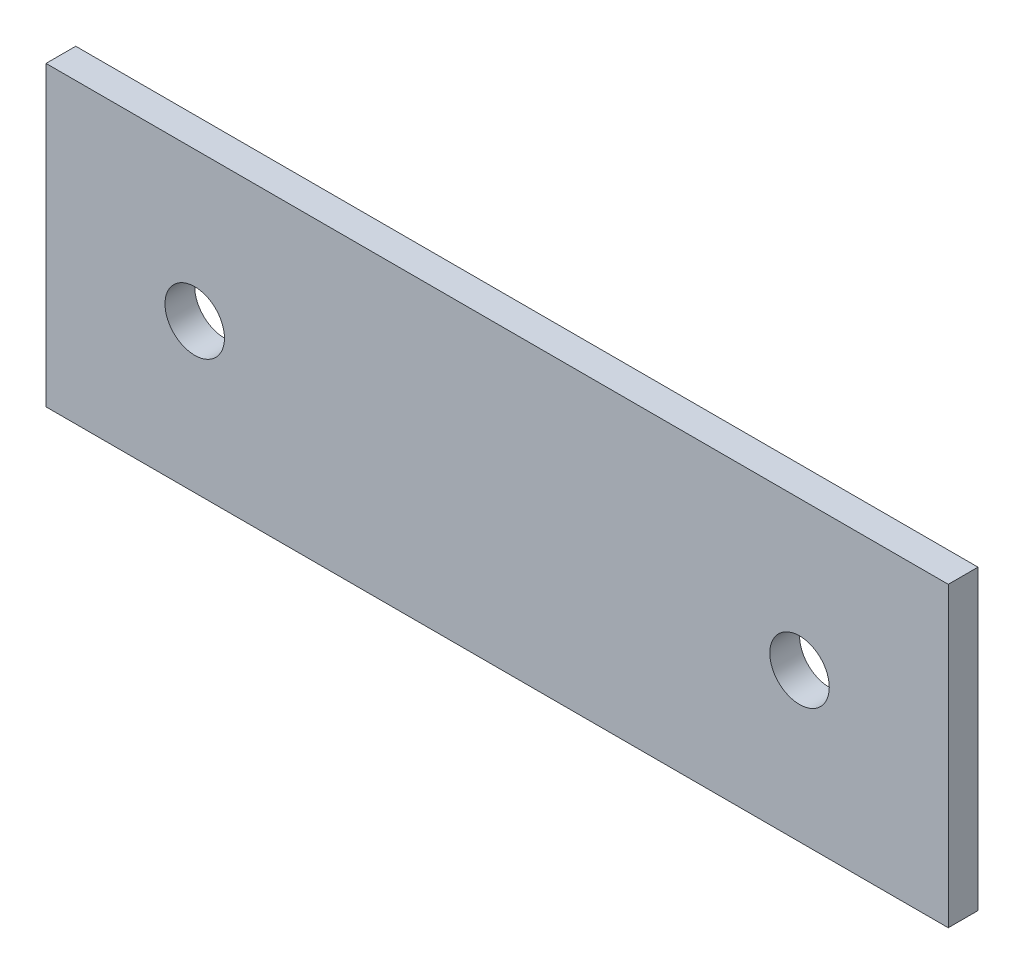
ISO-10303-21;
HEADER;
FILE_DESCRIPTION(('STEP AP214'),'2;1');
FILE_NAME('part.step','',(''),(''),'','','');
FILE_SCHEMA(('AUTOMOTIVE_DESIGN { 1 0 10303 214 1 1 1 1 }'));
ENDSEC;
DATA;
#1=APPLICATION_CONTEXT('core data for automotive mechanical design processes');
#2=APPLICATION_PROTOCOL_DEFINITION('international standard','automotive_design',2000,#1);
#3=PRODUCT_CONTEXT('',#1,'mechanical');
#4=PRODUCT('Part','Part','',(#3));
#5=PRODUCT_RELATED_PRODUCT_CATEGORY('part','',(#4));
#6=PRODUCT_DEFINITION_FORMATION('','',#4);
#7=PRODUCT_DEFINITION_CONTEXT('part definition',#1,'design');
#8=PRODUCT_DEFINITION('design','',#6,#7);
#9=PRODUCT_DEFINITION_SHAPE('','',#8);
#10=(LENGTH_UNIT() NAMED_UNIT(*) SI_UNIT(.MILLI.,.METRE.));
#11=(NAMED_UNIT(*) PLANE_ANGLE_UNIT() SI_UNIT($,.RADIAN.));
#12=(NAMED_UNIT(*) SI_UNIT($,.STERADIAN.) SOLID_ANGLE_UNIT());
#13=UNCERTAINTY_MEASURE_WITH_UNIT(LENGTH_MEASURE(1.E-05),#10,'distance_accuracy_value','');
#14=(GEOMETRIC_REPRESENTATION_CONTEXT(3) GLOBAL_UNCERTAINTY_ASSIGNED_CONTEXT((#13)) GLOBAL_UNIT_ASSIGNED_CONTEXT((#10,
#11,#12)) REPRESENTATION_CONTEXT('',''));
#15=CARTESIAN_POINT('',(0.,0.,0.));
#16=DIRECTION('',(0.,0.,1.));
#17=DIRECTION('',(1.,0.,0.));
#18=AXIS2_PLACEMENT_3D('',#15,#16,#17);
#19=CARTESIAN_POINT('',(-36.0672653272042,-0.000631578947363209,1.5));
#20=DIRECTION('',(0.,0.,1.));
#21=DIRECTION('',(1.,0.,0.));
#22=AXIS2_PLACEMENT_3D('',#19,#20,#21);
#23=PLANE('',#22);
#24=CARTESIAN_POINT('',(-28.5672653272042,7.49936842105264,1.5));
#25=DIRECTION('',(0.,0.,1.));
#26=DIRECTION('',(1.,0.,0.));
#27=AXIS2_PLACEMENT_3D('',#24,#25,#26);
#28=CIRCLE('',#27,1.5);
#29=CARTESIAN_POINT('',(-27.0672653272042,7.49936842105264,1.5));
#30=VERTEX_POINT('',#29);
#31=EDGE_CURVE('E98',#30,#30,#28,.T.);
#32=ORIENTED_EDGE('',*,*,#31,.F.);
#33=EDGE_LOOP('',(#32));
#34=FACE_BOUND('',#33,.T.);
#35=DIRECTION('',(0.,-1.,0.));
#36=VECTOR('',#35,1.);
#37=CARTESIAN_POINT('',(-36.0672653272042,14.9993684210526,1.5));
#38=LINE('',#37,#36);
#39=CARTESIAN_POINT('',(-36.0672653272042,14.9993684210526,1.5));
#40=VERTEX_POINT('',#39);
#41=CARTESIAN_POINT('',(-36.0672653272042,-0.000631578947363209,1.5));
#42=VERTEX_POINT('',#41);
#43=EDGE_CURVE('E83',#40,#42,#38,.T.);
#44=ORIENTED_EDGE('',*,*,#43,.T.);
#45=DIRECTION('',(1.,0.,0.));
#46=VECTOR('',#45,1.);
#47=CARTESIAN_POINT('',(-36.0672653272042,-0.000631578947363209,1.5));
#48=LINE('',#47,#46);
#49=CARTESIAN_POINT('',(9.43273467279583,-0.000631578947363209,1.5));
#50=VERTEX_POINT('',#49);
#51=EDGE_CURVE('E78',#42,#50,#48,.T.);
#52=ORIENTED_EDGE('',*,*,#51,.T.);
#53=DIRECTION('',(0.,1.,0.));
#54=VECTOR('',#53,1.);
#55=CARTESIAN_POINT('',(9.43273467279583,14.9993684210526,1.5));
#56=LINE('',#55,#54);
#57=CARTESIAN_POINT('',(9.43273467279583,14.9993684210526,1.5));
#58=VERTEX_POINT('',#57);
#59=EDGE_CURVE('E81',#50,#58,#56,.T.);
#60=ORIENTED_EDGE('',*,*,#59,.T.);
#61=DIRECTION('',(-1.,0.,0.));
#62=VECTOR('',#61,1.);
#63=CARTESIAN_POINT('',(-36.0672653272042,14.9993684210526,1.5));
#64=LINE('',#63,#62);
#65=EDGE_CURVE('E48',#58,#40,#64,.T.);
#66=ORIENTED_EDGE('',*,*,#65,.T.);
#67=EDGE_LOOP('',(#44,#52,#60,#66));
#68=FACE_BOUND('',#67,.T.);
#69=CARTESIAN_POINT('',(1.93273467279583,7.49936842105264,1.5));
#70=DIRECTION('',(0.,0.,1.));
#71=DIRECTION('',(1.,0.,0.));
#72=AXIS2_PLACEMENT_3D('',#69,#70,#71);
#73=CIRCLE('',#72,1.5);
#74=CARTESIAN_POINT('',(3.43273467279583,7.49936842105264,1.5));
#75=VERTEX_POINT('',#74);
#76=EDGE_CURVE('E113',#75,#75,#73,.T.);
#77=ORIENTED_EDGE('',*,*,#76,.F.);
#78=EDGE_LOOP('',(#77));
#79=FACE_BOUND('',#78,.T.);
#80=ADVANCED_FACE('F31',(#34,#68,#79),#23,.T.);
#81=CARTESIAN_POINT('',(-36.0672653272042,-0.000631578947363209,0.));
#82=DIRECTION('',(0.,0.,1.));
#83=DIRECTION('',(1.,0.,0.));
#84=AXIS2_PLACEMENT_3D('',#81,#82,#83);
#85=PLANE('',#84);
#86=CARTESIAN_POINT('',(-28.5672653272042,7.49936842105264,0.));
#87=DIRECTION('',(0.,0.,1.));
#88=DIRECTION('',(1.,0.,0.));
#89=AXIS2_PLACEMENT_3D('',#86,#87,#88);
#90=CIRCLE('',#89,1.5);
#91=CARTESIAN_POINT('',(-27.0672653272042,7.49936842105264,0.));
#92=VERTEX_POINT('',#91);
#93=EDGE_CURVE('E110',#92,#92,#90,.T.);
#94=ORIENTED_EDGE('',*,*,#93,.T.);
#95=EDGE_LOOP('',(#94));
#96=FACE_BOUND('',#95,.T.);
#97=DIRECTION('',(0.,-1.,0.));
#98=VECTOR('',#97,1.);
#99=CARTESIAN_POINT('',(-36.0672653272042,14.9993684210526,0.));
#100=LINE('',#99,#98);
#101=CARTESIAN_POINT('',(-36.0672653272042,14.9993684210526,0.));
#102=VERTEX_POINT('',#101);
#103=CARTESIAN_POINT('',(-36.0672653272042,-0.000631578947363209,0.));
#104=VERTEX_POINT('',#103);
#105=EDGE_CURVE('E95',#102,#104,#100,.T.);
#106=ORIENTED_EDGE('',*,*,#105,.F.);
#107=DIRECTION('',(-1.,0.,0.));
#108=VECTOR('',#107,1.);
#109=CARTESIAN_POINT('',(-36.0672653272042,14.9993684210526,0.));
#110=LINE('',#109,#108);
#111=CARTESIAN_POINT('',(9.43273467279583,14.9993684210526,0.));
#112=VERTEX_POINT('',#111);
#113=EDGE_CURVE('E71',#112,#102,#110,.T.);
#114=ORIENTED_EDGE('',*,*,#113,.F.);
#115=DIRECTION('',(0.,1.,0.));
#116=VECTOR('',#115,1.);
#117=CARTESIAN_POINT('',(9.43273467279583,14.9993684210526,0.));
#118=LINE('',#117,#116);
#119=CARTESIAN_POINT('',(9.43273467279583,-0.000631578947363209,0.));
#120=VERTEX_POINT('',#119);
#121=EDGE_CURVE('E65',#120,#112,#118,.T.);
#122=ORIENTED_EDGE('',*,*,#121,.F.);
#123=DIRECTION('',(1.,0.,0.));
#124=VECTOR('',#123,1.);
#125=CARTESIAN_POINT('',(-36.0672653272042,-0.000631578947363209,0.));
#126=LINE('',#125,#124);
#127=EDGE_CURVE('E87',#104,#120,#126,.T.);
#128=ORIENTED_EDGE('',*,*,#127,.F.);
#129=EDGE_LOOP('',(#106,#114,#122,#128));
#130=FACE_BOUND('',#129,.T.);
#131=CARTESIAN_POINT('',(1.93273467279583,7.49936842105264,0.));
#132=DIRECTION('',(0.,0.,1.));
#133=DIRECTION('',(1.,0.,0.));
#134=AXIS2_PLACEMENT_3D('',#131,#132,#133);
#135=CIRCLE('',#134,1.5);
#136=CARTESIAN_POINT('',(3.43273467279583,7.49936842105264,0.));
#137=VERTEX_POINT('',#136);
#138=EDGE_CURVE('E116',#137,#137,#135,.T.);
#139=ORIENTED_EDGE('',*,*,#138,.T.);
#140=EDGE_LOOP('',(#139));
#141=FACE_BOUND('',#140,.T.);
#142=ADVANCED_FACE('F106',(#96,#130,#141),#85,.F.);
#143=CARTESIAN_POINT('',(-36.0672653272042,14.9993684210526,1.5));
#144=DIRECTION('',(1.,0.,0.));
#145=DIRECTION('',(0.,1.,0.));
#146=AXIS2_PLACEMENT_3D('',#143,#144,#145);
#147=PLANE('',#146);
#148=ORIENTED_EDGE('',*,*,#105,.T.);
#149=DIRECTION('',(0.,0.,-1.));
#150=VECTOR('',#149,1.);
#151=CARTESIAN_POINT('',(-36.0672653272042,-0.000631578947363209,1.5));
#152=LINE('',#151,#150);
#153=EDGE_CURVE('E11',#42,#104,#152,.T.);
#154=ORIENTED_EDGE('',*,*,#153,.F.);
#155=ORIENTED_EDGE('',*,*,#43,.F.);
#156=DIRECTION('',(0.,0.,-1.));
#157=VECTOR('',#156,1.);
#158=CARTESIAN_POINT('',(-36.0672653272042,14.9993684210526,1.5));
#159=LINE('',#158,#157);
#160=EDGE_CURVE('E91',#40,#102,#159,.T.);
#161=ORIENTED_EDGE('',*,*,#160,.T.);
#162=EDGE_LOOP('',(#148,#154,#155,#161));
#163=FACE_BOUND('',#162,.T.);
#164=ADVANCED_FACE('F33',(#163),#147,.F.);
#165=CARTESIAN_POINT('',(-36.0672653272042,-0.000631578947363209,1.5));
#166=DIRECTION('',(0.,1.,0.));
#167=DIRECTION('',(0.,0.,1.));
#168=AXIS2_PLACEMENT_3D('',#165,#166,#167);
#169=PLANE('',#168);
#170=ORIENTED_EDGE('',*,*,#127,.T.);
#171=DIRECTION('',(0.,0.,-1.));
#172=VECTOR('',#171,1.);
#173=CARTESIAN_POINT('',(9.43273467279583,-0.000631578947363209,1.5));
#174=LINE('',#173,#172);
#175=EDGE_CURVE('E40',#50,#120,#174,.T.);
#176=ORIENTED_EDGE('',*,*,#175,.F.);
#177=ORIENTED_EDGE('',*,*,#51,.F.);
#178=ORIENTED_EDGE('',*,*,#153,.T.);
#179=EDGE_LOOP('',(#170,#176,#177,#178));
#180=FACE_BOUND('',#179,.T.);
#181=ADVANCED_FACE('F86',(#180),#169,.F.);
#182=CARTESIAN_POINT('',(9.43273467279583,14.9993684210526,1.5));
#183=DIRECTION('',(-1.,0.,0.));
#184=DIRECTION('',(0.,0.,1.));
#185=AXIS2_PLACEMENT_3D('',#182,#183,#184);
#186=PLANE('',#185);
#187=ORIENTED_EDGE('',*,*,#121,.T.);
#188=DIRECTION('',(0.,0.,-1.));
#189=VECTOR('',#188,1.);
#190=CARTESIAN_POINT('',(9.43273467279583,14.9993684210526,1.5));
#191=LINE('',#190,#189);
#192=EDGE_CURVE('E88',#58,#112,#191,.T.);
#193=ORIENTED_EDGE('',*,*,#192,.F.);
#194=ORIENTED_EDGE('',*,*,#59,.F.);
#195=ORIENTED_EDGE('',*,*,#175,.T.);
#196=EDGE_LOOP('',(#187,#193,#194,#195));
#197=FACE_BOUND('',#196,.T.);
#198=ADVANCED_FACE('F89',(#197),#186,.F.);
#199=CARTESIAN_POINT('',(-36.0672653272042,14.9993684210526,1.5));
#200=DIRECTION('',(0.,-1.,0.));
#201=DIRECTION('',(0.,0.,-1.));
#202=AXIS2_PLACEMENT_3D('',#199,#200,#201);
#203=PLANE('',#202);
#204=ORIENTED_EDGE('',*,*,#113,.T.);
#205=ORIENTED_EDGE('',*,*,#160,.F.);
#206=ORIENTED_EDGE('',*,*,#65,.F.);
#207=ORIENTED_EDGE('',*,*,#192,.T.);
#208=EDGE_LOOP('',(#204,#205,#206,#207));
#209=FACE_BOUND('',#208,.T.);
#210=ADVANCED_FACE('F103',(#209),#203,.F.);
#211=CARTESIAN_POINT('',(-28.5672653272042,7.49936842105264,1.5));
#212=DIRECTION('',(0.,0.,-1.));
#213=DIRECTION('',(-1.,0.,0.));
#214=AXIS2_PLACEMENT_3D('',#211,#212,#213);
#215=CYLINDRICAL_SURFACE('',#214,1.5);
#216=ORIENTED_EDGE('',*,*,#31,.T.);
#217=EDGE_LOOP('',(#216));
#218=FACE_BOUND('',#217,.T.);
#219=ORIENTED_EDGE('',*,*,#93,.F.);
#220=EDGE_LOOP('',(#219));
#221=FACE_BOUND('',#220,.T.);
#222=ADVANCED_FACE('F134',(#218,#221),#215,.F.);
#223=CARTESIAN_POINT('',(1.93273467279583,7.49936842105264,1.5));
#224=DIRECTION('',(0.,0.,-1.));
#225=DIRECTION('',(-1.,0.,0.));
#226=AXIS2_PLACEMENT_3D('',#223,#224,#225);
#227=CYLINDRICAL_SURFACE('',#226,1.5);
#228=ORIENTED_EDGE('',*,*,#76,.T.);
#229=EDGE_LOOP('',(#228));
#230=FACE_BOUND('',#229,.T.);
#231=ORIENTED_EDGE('',*,*,#138,.F.);
#232=EDGE_LOOP('',(#231));
#233=FACE_BOUND('',#232,.T.);
#234=ADVANCED_FACE('F122',(#230,#233),#227,.F.);
#235=CLOSED_SHELL('',(#80,#142,#164,#181,#198,#210,#222,#234));
#236=MANIFOLD_SOLID_BREP('B2',#235);
#237=ADVANCED_BREP_SHAPE_REPRESENTATION('',(#18,#236),#14);
#238=SHAPE_DEFINITION_REPRESENTATION(#9,#237);
ENDSEC;
END-ISO-10303-21;
